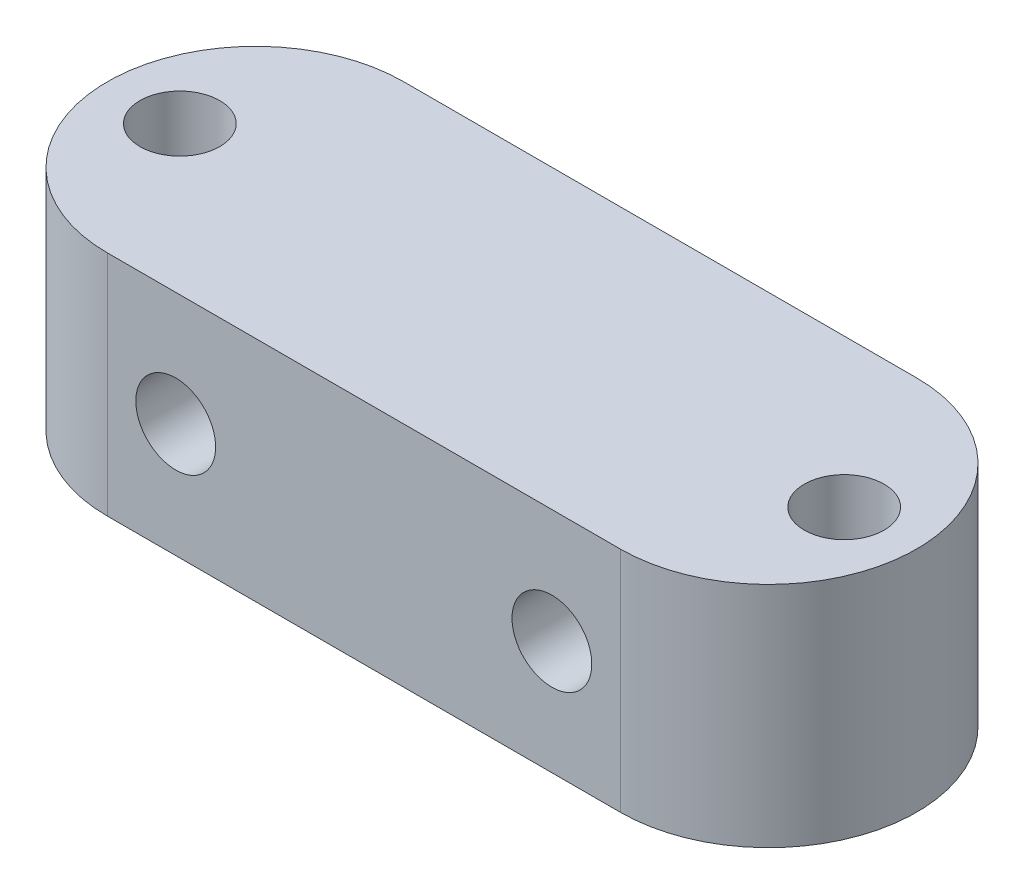
ISO-10303-21;
HEADER;
FILE_DESCRIPTION(('STEP AP214'),'2;1');
FILE_NAME('part.step','',(''),(''),'','','');
FILE_SCHEMA(('AUTOMOTIVE_DESIGN { 1 0 10303 214 1 1 1 1 }'));
ENDSEC;
DATA;
#1=APPLICATION_CONTEXT('core data for automotive mechanical design processes');
#2=APPLICATION_PROTOCOL_DEFINITION('international standard','automotive_design',2000,#1);
#3=PRODUCT_CONTEXT('',#1,'mechanical');
#4=PRODUCT('Part','Part','',(#3));
#5=PRODUCT_RELATED_PRODUCT_CATEGORY('part','',(#4));
#6=PRODUCT_DEFINITION_FORMATION('','',#4);
#7=PRODUCT_DEFINITION_CONTEXT('part definition',#1,'design');
#8=PRODUCT_DEFINITION('design','',#6,#7);
#9=PRODUCT_DEFINITION_SHAPE('','',#8);
#10=(LENGTH_UNIT() NAMED_UNIT(*) SI_UNIT(.MILLI.,.METRE.));
#11=(NAMED_UNIT(*) PLANE_ANGLE_UNIT() SI_UNIT($,.RADIAN.));
#12=(NAMED_UNIT(*) SI_UNIT($,.STERADIAN.) SOLID_ANGLE_UNIT());
#13=UNCERTAINTY_MEASURE_WITH_UNIT(LENGTH_MEASURE(1.E-05),#10,'distance_accuracy_value','');
#14=(GEOMETRIC_REPRESENTATION_CONTEXT(3) GLOBAL_UNCERTAINTY_ASSIGNED_CONTEXT((#13)) GLOBAL_UNIT_ASSIGNED_CONTEXT((#10,
#11,#12)) REPRESENTATION_CONTEXT('',''));
#15=CARTESIAN_POINT('',(0.,0.,0.));
#16=DIRECTION('',(0.,0.,1.));
#17=DIRECTION('',(1.,0.,0.));
#18=AXIS2_PLACEMENT_3D('',#15,#16,#17);
#19=CARTESIAN_POINT('',(-79.5992809911218,10.,0.551667217024537));
#20=DIRECTION('',(0.,1.,0.));
#21=DIRECTION('',(0.,0.,1.));
#22=AXIS2_PLACEMENT_3D('',#19,#20,#21);
#23=PLANE('',#22);
#24=CARTESIAN_POINT('',(-105.419280991122,10.,0.551667217024537));
#25=DIRECTION('',(0.,1.,0.));
#26=DIRECTION('',(0.,0.,1.));
#27=AXIS2_PLACEMENT_3D('',#24,#25,#26);
#28=CIRCLE('',#27,1.75);
#29=CARTESIAN_POINT('',(-105.419280991122,10.,2.30166721702453));
#30=VERTEX_POINT('',#29);
#31=EDGE_CURVE('E117',#30,#30,#28,.T.);
#32=ORIENTED_EDGE('',*,*,#31,.F.);
#33=EDGE_LOOP('',(#32));
#34=FACE_BOUND('',#33,.T.);
#35=CARTESIAN_POINT('',(-79.5992809911218,10.,0.551667217024537));
#36=DIRECTION('',(0.,1.,0.));
#37=DIRECTION('',(0.,0.,1.));
#38=AXIS2_PLACEMENT_3D('',#35,#36,#37);
#39=CIRCLE('',#38,6.5);
#40=CARTESIAN_POINT('',(-79.5992809911218,10.,7.05166721702454));
#41=VERTEX_POINT('',#40);
#42=CARTESIAN_POINT('',(-79.5992809911218,10.,-5.94833278297546));
#43=VERTEX_POINT('',#42);
#44=EDGE_CURVE('E96',#41,#43,#39,.T.);
#45=ORIENTED_EDGE('',*,*,#44,.T.);
#46=DIRECTION('',(-1.,0.,0.));
#47=VECTOR('',#46,1.);
#48=CARTESIAN_POINT('',(-102.099280991122,10.,-5.94833278297546));
#49=LINE('',#48,#47);
#50=CARTESIAN_POINT('',(-102.099280991122,10.,-5.94833278297546));
#51=VERTEX_POINT('',#50);
#52=EDGE_CURVE('E91',#43,#51,#49,.T.);
#53=ORIENTED_EDGE('',*,*,#52,.T.);
#54=CARTESIAN_POINT('',(-102.099280991122,10.,0.551667217024533));
#55=DIRECTION('',(0.,1.,0.));
#56=DIRECTION('',(0.,0.,1.));
#57=AXIS2_PLACEMENT_3D('',#54,#55,#56);
#58=CIRCLE('',#57,6.5);
#59=CARTESIAN_POINT('',(-102.099280991122,10.,7.05166721702453));
#60=VERTEX_POINT('',#59);
#61=EDGE_CURVE('E94',#51,#60,#58,.T.);
#62=ORIENTED_EDGE('',*,*,#61,.T.);
#63=DIRECTION('',(1.,0.,0.));
#64=VECTOR('',#63,1.);
#65=CARTESIAN_POINT('',(-102.099280991122,10.,7.05166721702454));
#66=LINE('',#65,#64);
#67=EDGE_CURVE('E61',#60,#41,#66,.T.);
#68=ORIENTED_EDGE('',*,*,#67,.T.);
#69=EDGE_LOOP('',(#45,#53,#62,#68));
#70=FACE_BOUND('',#69,.T.);
#71=CARTESIAN_POINT('',(-76.2792809911218,10.,0.551667217024536));
#72=DIRECTION('',(0.,1.,0.));
#73=DIRECTION('',(0.,0.,1.));
#74=AXIS2_PLACEMENT_3D('',#71,#72,#73);
#75=CIRCLE('',#74,1.75);
#76=CARTESIAN_POINT('',(-76.2792809911218,10.,2.30166721702453));
#77=VERTEX_POINT('',#76);
#78=EDGE_CURVE('E146',#77,#77,#75,.T.);
#79=ORIENTED_EDGE('',*,*,#78,.F.);
#80=EDGE_LOOP('',(#79));
#81=FACE_BOUND('',#80,.T.);
#82=ADVANCED_FACE('F41',(#34,#70,#81),#23,.T.);
#83=CARTESIAN_POINT('',(-79.5992809911218,0.,0.551667217024537));
#84=DIRECTION('',(0.,1.,0.));
#85=DIRECTION('',(0.,0.,1.));
#86=AXIS2_PLACEMENT_3D('',#83,#84,#85);
#87=PLANE('',#86);
#88=CARTESIAN_POINT('',(-79.5992809911218,0.,0.551667217024537));
#89=DIRECTION('',(0.,1.,0.));
#90=DIRECTION('',(0.,0.,1.));
#91=AXIS2_PLACEMENT_3D('',#88,#89,#90);
#92=CIRCLE('',#91,6.5);
#93=CARTESIAN_POINT('',(-79.5992809911218,0.,7.05166721702454));
#94=VERTEX_POINT('',#93);
#95=CARTESIAN_POINT('',(-79.5992809911218,0.,-5.94833278297546));
#96=VERTEX_POINT('',#95);
#97=EDGE_CURVE('E113',#94,#96,#92,.T.);
#98=ORIENTED_EDGE('',*,*,#97,.F.);
#99=DIRECTION('',(1.,0.,0.));
#100=VECTOR('',#99,1.);
#101=CARTESIAN_POINT('',(-102.099280991122,0.,7.05166721702454));
#102=LINE('',#101,#100);
#103=CARTESIAN_POINT('',(-102.099280991122,0.,7.05166721702453));
#104=VERTEX_POINT('',#103);
#105=EDGE_CURVE('E84',#104,#94,#102,.T.);
#106=ORIENTED_EDGE('',*,*,#105,.F.);
#107=CARTESIAN_POINT('',(-102.099280991122,0.,0.551667217024533));
#108=DIRECTION('',(0.,1.,0.));
#109=DIRECTION('',(0.,0.,1.));
#110=AXIS2_PLACEMENT_3D('',#107,#108,#109);
#111=CIRCLE('',#110,6.5);
#112=CARTESIAN_POINT('',(-102.099280991122,0.,-5.94833278297546));
#113=VERTEX_POINT('',#112);
#114=EDGE_CURVE('E78',#113,#104,#111,.T.);
#115=ORIENTED_EDGE('',*,*,#114,.F.);
#116=DIRECTION('',(-1.,0.,0.));
#117=VECTOR('',#116,1.);
#118=CARTESIAN_POINT('',(-102.099280991122,0.,-5.94833278297546));
#119=LINE('',#118,#117);
#120=EDGE_CURVE('E101',#96,#113,#119,.T.);
#121=ORIENTED_EDGE('',*,*,#120,.F.);
#122=EDGE_LOOP('',(#98,#106,#115,#121));
#123=FACE_BOUND('',#122,.T.);
#124=CARTESIAN_POINT('',(-105.419280991122,0.,0.551667217024537));
#125=DIRECTION('',(0.,1.,0.));
#126=DIRECTION('',(0.,0.,1.));
#127=AXIS2_PLACEMENT_3D('',#124,#125,#126);
#128=CIRCLE('',#127,1.75);
#129=CARTESIAN_POINT('',(-105.419280991122,0.,2.30166721702453));
#130=VERTEX_POINT('',#129);
#131=EDGE_CURVE('E150',#130,#130,#128,.T.);
#132=ORIENTED_EDGE('',*,*,#131,.T.);
#133=EDGE_LOOP('',(#132));
#134=FACE_BOUND('',#133,.T.);
#135=CARTESIAN_POINT('',(-76.2792809911218,0.,0.551667217024536));
#136=DIRECTION('',(0.,1.,0.));
#137=DIRECTION('',(0.,0.,1.));
#138=AXIS2_PLACEMENT_3D('',#135,#136,#137);
#139=CIRCLE('',#138,1.75);
#140=CARTESIAN_POINT('',(-76.2792809911218,0.,2.30166721702453));
#141=VERTEX_POINT('',#140);
#142=EDGE_CURVE('E136',#141,#141,#139,.T.);
#143=ORIENTED_EDGE('',*,*,#142,.T.);
#144=EDGE_LOOP('',(#143));
#145=FACE_BOUND('',#144,.T.);
#146=ADVANCED_FACE('F162',(#123,#134,#145),#87,.F.);
#147=CARTESIAN_POINT('',(-79.5992809911218,10.,0.551667217024537));
#148=DIRECTION('',(0.,-1.,0.));
#149=DIRECTION('',(0.,0.,-1.));
#150=AXIS2_PLACEMENT_3D('',#147,#148,#149);
#151=CYLINDRICAL_SURFACE('',#150,6.5);
#152=ORIENTED_EDGE('',*,*,#97,.T.);
#153=DIRECTION('',(0.,-1.,0.));
#154=VECTOR('',#153,1.);
#155=CARTESIAN_POINT('',(-79.5992809911218,10.,-5.94833278297546));
#156=LINE('',#155,#154);
#157=EDGE_CURVE('E11',#43,#96,#156,.T.);
#158=ORIENTED_EDGE('',*,*,#157,.F.);
#159=ORIENTED_EDGE('',*,*,#44,.F.);
#160=DIRECTION('',(0.,-1.,0.));
#161=VECTOR('',#160,1.);
#162=CARTESIAN_POINT('',(-79.5992809911218,10.,7.05166721702454));
#163=LINE('',#162,#161);
#164=EDGE_CURVE('E109',#41,#94,#163,.T.);
#165=ORIENTED_EDGE('',*,*,#164,.T.);
#166=EDGE_LOOP('',(#152,#158,#159,#165));
#167=FACE_BOUND('',#166,.T.);
#168=ADVANCED_FACE('F43',(#167),#151,.T.);
#169=CARTESIAN_POINT('',(-102.099280991122,10.,-5.94833278297546));
#170=DIRECTION('',(0.,0.,1.));
#171=DIRECTION('',(1.,0.,0.));
#172=AXIS2_PLACEMENT_3D('',#169,#170,#171);
#173=PLANE('',#172);
#174=CARTESIAN_POINT('',(-99.0992809911218,5.,-5.94833278297546));
#175=DIRECTION('',(0.,0.,-1.));
#176=DIRECTION('',(-1.,0.,0.));
#177=AXIS2_PLACEMENT_3D('',#174,#175,#176);
#178=CIRCLE('',#177,1.75);
#179=CARTESIAN_POINT('',(-100.849280991122,5.,-5.94833278297546));
#180=VERTEX_POINT('',#179);
#181=EDGE_CURVE('E130',#180,#180,#178,.T.);
#182=ORIENTED_EDGE('',*,*,#181,.F.);
#183=EDGE_LOOP('',(#182));
#184=FACE_BOUND('',#183,.T.);
#185=CARTESIAN_POINT('',(-82.5992809911218,5.,-5.94833278297546));
#186=DIRECTION('',(0.,0.,-1.));
#187=DIRECTION('',(-1.,0.,0.));
#188=AXIS2_PLACEMENT_3D('',#185,#186,#187);
#189=CIRCLE('',#188,1.75);
#190=CARTESIAN_POINT('',(-84.3492809911218,5.,-5.94833278297546));
#191=VERTEX_POINT('',#190);
#192=EDGE_CURVE('E138',#191,#191,#189,.T.);
#193=ORIENTED_EDGE('',*,*,#192,.F.);
#194=EDGE_LOOP('',(#193));
#195=FACE_BOUND('',#194,.T.);
#196=ORIENTED_EDGE('',*,*,#120,.T.);
#197=DIRECTION('',(0.,-1.,0.));
#198=VECTOR('',#197,1.);
#199=CARTESIAN_POINT('',(-102.099280991122,10.,-5.94833278297546));
#200=LINE('',#199,#198);
#201=EDGE_CURVE('E52',#51,#113,#200,.T.);
#202=ORIENTED_EDGE('',*,*,#201,.F.);
#203=ORIENTED_EDGE('',*,*,#52,.F.);
#204=ORIENTED_EDGE('',*,*,#157,.T.);
#205=EDGE_LOOP('',(#196,#202,#203,#204));
#206=FACE_BOUND('',#205,.T.);
#207=ADVANCED_FACE('F100',(#184,#195,#206),#173,.F.);
#208=CARTESIAN_POINT('',(-102.099280991122,10.,0.551667217024533));
#209=DIRECTION('',(0.,-1.,0.));
#210=DIRECTION('',(0.,0.,-1.));
#211=AXIS2_PLACEMENT_3D('',#208,#209,#210);
#212=CYLINDRICAL_SURFACE('',#211,6.5);
#213=ORIENTED_EDGE('',*,*,#114,.T.);
#214=DIRECTION('',(0.,-1.,0.));
#215=VECTOR('',#214,1.);
#216=CARTESIAN_POINT('',(-102.099280991122,10.,7.05166721702453));
#217=LINE('',#216,#215);
#218=EDGE_CURVE('E103',#60,#104,#217,.T.);
#219=ORIENTED_EDGE('',*,*,#218,.F.);
#220=ORIENTED_EDGE('',*,*,#61,.F.);
#221=ORIENTED_EDGE('',*,*,#201,.T.);
#222=EDGE_LOOP('',(#213,#219,#220,#221));
#223=FACE_BOUND('',#222,.T.);
#224=ADVANCED_FACE('F105',(#223),#212,.T.);
#225=CARTESIAN_POINT('',(-102.099280991122,10.,7.05166721702454));
#226=DIRECTION('',(0.,0.,-1.));
#227=DIRECTION('',(-1.,0.,0.));
#228=AXIS2_PLACEMENT_3D('',#225,#226,#227);
#229=PLANE('',#228);
#230=CARTESIAN_POINT('',(-99.0992809911218,5.,7.05166721702454));
#231=DIRECTION('',(0.,0.,-1.));
#232=DIRECTION('',(-1.,0.,0.));
#233=AXIS2_PLACEMENT_3D('',#230,#231,#232);
#234=CIRCLE('',#233,1.75);
#235=CARTESIAN_POINT('',(-100.849280991122,5.,7.05166721702454));
#236=VERTEX_POINT('',#235);
#237=EDGE_CURVE('E45',#236,#236,#234,.T.);
#238=ORIENTED_EDGE('',*,*,#237,.T.);
#239=EDGE_LOOP('',(#238));
#240=FACE_BOUND('',#239,.T.);
#241=CARTESIAN_POINT('',(-82.5992809911218,5.,7.05166721702454));
#242=DIRECTION('',(0.,0.,-1.));
#243=DIRECTION('',(-1.,0.,0.));
#244=AXIS2_PLACEMENT_3D('',#241,#242,#243);
#245=CIRCLE('',#244,1.75);
#246=CARTESIAN_POINT('',(-84.3492809911218,5.,7.05166721702454));
#247=VERTEX_POINT('',#246);
#248=EDGE_CURVE('E127',#247,#247,#245,.T.);
#249=ORIENTED_EDGE('',*,*,#248,.T.);
#250=EDGE_LOOP('',(#249));
#251=FACE_BOUND('',#250,.T.);
#252=ORIENTED_EDGE('',*,*,#105,.T.);
#253=ORIENTED_EDGE('',*,*,#164,.F.);
#254=ORIENTED_EDGE('',*,*,#67,.F.);
#255=ORIENTED_EDGE('',*,*,#218,.T.);
#256=EDGE_LOOP('',(#252,#253,#254,#255));
#257=FACE_BOUND('',#256,.T.);
#258=ADVANCED_FACE('F168',(#240,#251,#257),#229,.F.);
#259=CARTESIAN_POINT('',(-105.419280991122,10.,0.551667217024537));
#260=DIRECTION('',(0.,-1.,0.));
#261=DIRECTION('',(0.,0.,-1.));
#262=AXIS2_PLACEMENT_3D('',#259,#260,#261);
#263=CYLINDRICAL_SURFACE('',#262,1.75);
#264=ORIENTED_EDGE('',*,*,#31,.T.);
#265=EDGE_LOOP('',(#264));
#266=FACE_BOUND('',#265,.T.);
#267=ORIENTED_EDGE('',*,*,#131,.F.);
#268=EDGE_LOOP('',(#267));
#269=FACE_BOUND('',#268,.T.);
#270=ADVANCED_FACE('F165',(#266,#269),#263,.F.);
#271=CARTESIAN_POINT('',(-76.2792809911218,10.,0.551667217024536));
#272=DIRECTION('',(0.,-1.,0.));
#273=DIRECTION('',(0.,0.,-1.));
#274=AXIS2_PLACEMENT_3D('',#271,#272,#273);
#275=CYLINDRICAL_SURFACE('',#274,1.75);
#276=ORIENTED_EDGE('',*,*,#78,.T.);
#277=EDGE_LOOP('',(#276));
#278=FACE_BOUND('',#277,.T.);
#279=ORIENTED_EDGE('',*,*,#142,.F.);
#280=EDGE_LOOP('',(#279));
#281=FACE_BOUND('',#280,.T.);
#282=ADVANCED_FACE('F167',(#278,#281),#275,.F.);
#283=CARTESIAN_POINT('',(-82.5992809911218,5.,15.0516672170245));
#284=DIRECTION('',(0.,0.,-1.));
#285=DIRECTION('',(-1.,0.,0.));
#286=AXIS2_PLACEMENT_3D('',#283,#284,#285);
#287=CYLINDRICAL_SURFACE('',#286,1.75);
#288=ORIENTED_EDGE('',*,*,#192,.T.);
#289=EDGE_LOOP('',(#288));
#290=FACE_BOUND('',#289,.T.);
#291=ORIENTED_EDGE('',*,*,#248,.F.);
#292=EDGE_LOOP('',(#291));
#293=FACE_BOUND('',#292,.T.);
#294=ADVANCED_FACE('F175',(#290,#293),#287,.F.);
#295=CARTESIAN_POINT('',(-99.0992809911218,5.,15.0516672170245));
#296=DIRECTION('',(0.,0.,-1.));
#297=DIRECTION('',(-1.,0.,0.));
#298=AXIS2_PLACEMENT_3D('',#295,#296,#297);
#299=CYLINDRICAL_SURFACE('',#298,1.75);
#300=ORIENTED_EDGE('',*,*,#181,.T.);
#301=EDGE_LOOP('',(#300));
#302=FACE_BOUND('',#301,.T.);
#303=ORIENTED_EDGE('',*,*,#237,.F.);
#304=EDGE_LOOP('',(#303));
#305=FACE_BOUND('',#304,.T.);
#306=ADVANCED_FACE('F202',(#302,#305),#299,.F.);
#307=CLOSED_SHELL('',(#82,#146,#168,#207,#224,#258,#270,#282,#294,#306));
#308=MANIFOLD_SOLID_BREP('B2',#307);
#309=ADVANCED_BREP_SHAPE_REPRESENTATION('',(#18,#308),#14);
#310=SHAPE_DEFINITION_REPRESENTATION(#9,#309);
ENDSEC;
END-ISO-10303-21;
